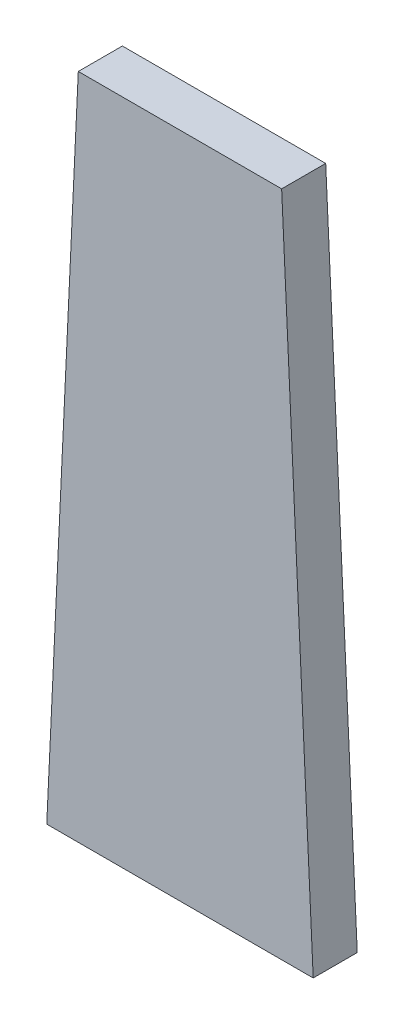
ISO-10303-21;
HEADER;
FILE_DESCRIPTION(('STEP AP214'),'2;1');
FILE_NAME('part.step','',(''),(''),'','','');
FILE_SCHEMA(('AUTOMOTIVE_DESIGN { 1 0 10303 214 1 1 1 1 }'));
ENDSEC;
DATA;
#1=APPLICATION_CONTEXT('core data for automotive mechanical design processes');
#2=APPLICATION_PROTOCOL_DEFINITION('international standard','automotive_design',2000,#1);
#3=PRODUCT_CONTEXT('',#1,'mechanical');
#4=PRODUCT('Part','Part','',(#3));
#5=PRODUCT_RELATED_PRODUCT_CATEGORY('part','',(#4));
#6=PRODUCT_DEFINITION_FORMATION('','',#4);
#7=PRODUCT_DEFINITION_CONTEXT('part definition',#1,'design');
#8=PRODUCT_DEFINITION('design','',#6,#7);
#9=PRODUCT_DEFINITION_SHAPE('','',#8);
#10=(LENGTH_UNIT() NAMED_UNIT(*) SI_UNIT(.MILLI.,.METRE.));
#11=(NAMED_UNIT(*) PLANE_ANGLE_UNIT() SI_UNIT($,.RADIAN.));
#12=(NAMED_UNIT(*) SI_UNIT($,.STERADIAN.) SOLID_ANGLE_UNIT());
#13=UNCERTAINTY_MEASURE_WITH_UNIT(LENGTH_MEASURE(1.E-05),#10,'distance_accuracy_value','');
#14=(GEOMETRIC_REPRESENTATION_CONTEXT(3) GLOBAL_UNCERTAINTY_ASSIGNED_CONTEXT((#13)) GLOBAL_UNIT_ASSIGNED_CONTEXT((#10,
#11,#12)) REPRESENTATION_CONTEXT('',''));
#15=CARTESIAN_POINT('',(0.,0.,0.));
#16=DIRECTION('',(0.,0.,1.));
#17=DIRECTION('',(1.,0.,0.));
#18=AXIS2_PLACEMENT_3D('',#15,#16,#17);
#19=CARTESIAN_POINT('',(1.15384615384615,8.07692307692307,0.5));
#20=DIRECTION('',(-0.998884766924445,-0.0472146418634893,0.));
#21=DIRECTION('',(0.0472146418634893,-0.998884766924445,0.));
#22=AXIS2_PLACEMENT_3D('',#19,#20,#21);
#23=PLANE('',#22);
#24=DIRECTION('',(0.0472146418634893,-0.998884766924445,0.));
#25=VECTOR('',#24,1.);
#26=CARTESIAN_POINT('',(1.15384615384615,8.07692307692307,1.));
#27=LINE('',#26,#25);
#28=CARTESIAN_POINT('',(1.15384615384615,8.07692307692307,1.));
#29=VERTEX_POINT('',#28);
#30=CARTESIAN_POINT('',(1.51198727417338,0.5,1.));
#31=VERTEX_POINT('',#30);
#32=EDGE_CURVE('E43',#29,#31,#27,.T.);
#33=ORIENTED_EDGE('',*,*,#32,.T.);
#34=DIRECTION('',(0.,0.,-1.));
#35=VECTOR('',#34,1.);
#36=CARTESIAN_POINT('',(1.51198727417339,0.5,0.5));
#37=LINE('',#36,#35);
#38=CARTESIAN_POINT('',(1.51198727417339,0.5,0.5));
#39=VERTEX_POINT('',#38);
#40=EDGE_CURVE('E57',#31,#39,#37,.T.);
#41=ORIENTED_EDGE('',*,*,#40,.T.);
#42=DIRECTION('',(0.0472146418634893,-0.998884766924445,0.));
#43=VECTOR('',#42,1.);
#44=CARTESIAN_POINT('',(1.15384615384615,8.07692307692307,0.5));
#45=LINE('',#44,#43);
#46=CARTESIAN_POINT('',(1.15384615384615,8.07692307692307,0.5));
#47=VERTEX_POINT('',#46);
#48=EDGE_CURVE('E81',#47,#39,#45,.T.);
#49=ORIENTED_EDGE('',*,*,#48,.F.);
#50=DIRECTION('',(0.,0.,1.));
#51=VECTOR('',#50,1.);
#52=CARTESIAN_POINT('',(1.15384615384615,8.07692307692307,0.5));
#53=LINE('',#52,#51);
#54=EDGE_CURVE('E95',#47,#29,#53,.T.);
#55=ORIENTED_EDGE('',*,*,#54,.T.);
#56=EDGE_LOOP('',(#33,#41,#49,#55));
#57=FACE_BOUND('',#56,.T.);
#58=ADVANCED_FACE('F39',(#57),#23,.F.);
#59=CARTESIAN_POINT('',(-1.92307692307693,-8.19711538461539,0.5));
#60=DIRECTION('',(0.998884766924445,-0.0472146418634893,0.));
#61=DIRECTION('',(0.0472146418634893,0.998884766924445,0.));
#62=AXIS2_PLACEMENT_3D('',#59,#60,#61);
#63=PLANE('',#62);
#64=DIRECTION('',(0.0472146418634893,0.998884766924445,0.));
#65=VECTOR('',#64,1.);
#66=CARTESIAN_POINT('',(-1.92307692307693,-8.19711538461539,0.5));
#67=LINE('',#66,#65);
#68=CARTESIAN_POINT('',(-1.51198727417339,0.5,0.5));
#69=VERTEX_POINT('',#68);
#70=CARTESIAN_POINT('',(-1.15384615384616,8.07692307692307,0.5));
#71=VERTEX_POINT('',#70);
#72=EDGE_CURVE('E91',#69,#71,#67,.T.);
#73=ORIENTED_EDGE('',*,*,#72,.F.);
#74=DIRECTION('',(0.,0.,1.));
#75=VECTOR('',#74,1.);
#76=CARTESIAN_POINT('',(-1.51198727417339,0.5,0.5));
#77=LINE('',#76,#75);
#78=CARTESIAN_POINT('',(-1.51198727417339,0.5,1.));
#79=VERTEX_POINT('',#78);
#80=EDGE_CURVE('E73',#69,#79,#77,.T.);
#81=ORIENTED_EDGE('',*,*,#80,.T.);
#82=DIRECTION('',(0.0472146418634893,0.998884766924445,0.));
#83=VECTOR('',#82,1.);
#84=CARTESIAN_POINT('',(-1.92307692307693,-8.19711538461539,1.));
#85=LINE('',#84,#83);
#86=CARTESIAN_POINT('',(-1.15384615384616,8.07692307692307,1.));
#87=VERTEX_POINT('',#86);
#88=EDGE_CURVE('E87',#79,#87,#85,.T.);
#89=ORIENTED_EDGE('',*,*,#88,.T.);
#90=DIRECTION('',(0.,0.,1.));
#91=VECTOR('',#90,1.);
#92=CARTESIAN_POINT('',(-1.15384615384616,8.07692307692307,0.5));
#93=LINE('',#92,#91);
#94=EDGE_CURVE('E47',#71,#87,#93,.T.);
#95=ORIENTED_EDGE('',*,*,#94,.F.);
#96=EDGE_LOOP('',(#73,#81,#89,#95));
#97=FACE_BOUND('',#96,.T.);
#98=ADVANCED_FACE('F90',(#97),#63,.F.);
#99=CARTESIAN_POINT('',(0.,0.,0.5));
#100=DIRECTION('',(0.,0.,-1.));
#101=DIRECTION('',(-1.,0.,0.));
#102=AXIS2_PLACEMENT_3D('',#99,#100,#101);
#103=PLANE('',#102);
#104=DIRECTION('',(1.,0.,0.));
#105=VECTOR('',#104,1.);
#106=CARTESIAN_POINT('',(0.,0.5,0.5));
#107=LINE('',#106,#105);
#108=EDGE_CURVE('E11',#69,#39,#107,.T.);
#109=ORIENTED_EDGE('',*,*,#108,.F.);
#110=ORIENTED_EDGE('',*,*,#72,.T.);
#111=DIRECTION('',(1.,0.,0.));
#112=VECTOR('',#111,1.);
#113=CARTESIAN_POINT('',(-1.15384615384616,8.07692307692307,0.5));
#114=LINE('',#113,#112);
#115=EDGE_CURVE('E96',#71,#47,#114,.T.);
#116=ORIENTED_EDGE('',*,*,#115,.T.);
#117=ORIENTED_EDGE('',*,*,#48,.T.);
#118=EDGE_LOOP('',(#109,#110,#116,#117));
#119=FACE_BOUND('',#118,.T.);
#120=ADVANCED_FACE('F111',(#119),#103,.T.);
#121=CARTESIAN_POINT('',(0.,0.,1.));
#122=DIRECTION('',(0.,0.,-1.));
#123=DIRECTION('',(-1.,0.,0.));
#124=AXIS2_PLACEMENT_3D('',#121,#122,#123);
#125=PLANE('',#124);
#126=ORIENTED_EDGE('',*,*,#88,.F.);
#127=DIRECTION('',(1.,0.,0.));
#128=VECTOR('',#127,1.);
#129=CARTESIAN_POINT('',(-17.,0.5,1.));
#130=LINE('',#129,#128);
#131=EDGE_CURVE('E77',#79,#31,#130,.T.);
#132=ORIENTED_EDGE('',*,*,#131,.T.);
#133=ORIENTED_EDGE('',*,*,#32,.F.);
#134=DIRECTION('',(1.,0.,0.));
#135=VECTOR('',#134,1.);
#136=CARTESIAN_POINT('',(-1.15384615384616,8.07692307692307,1.));
#137=LINE('',#136,#135);
#138=EDGE_CURVE('E85',#87,#29,#137,.T.);
#139=ORIENTED_EDGE('',*,*,#138,.F.);
#140=EDGE_LOOP('',(#126,#132,#133,#139));
#141=FACE_BOUND('',#140,.T.);
#142=ADVANCED_FACE('F41',(#141),#125,.F.);
#143=CARTESIAN_POINT('',(-1.15384615384616,8.07692307692307,0.5));
#144=DIRECTION('',(0.,-1.,0.));
#145=DIRECTION('',(0.,0.,-1.));
#146=AXIS2_PLACEMENT_3D('',#143,#144,#145);
#147=PLANE('',#146);
#148=ORIENTED_EDGE('',*,*,#138,.T.);
#149=ORIENTED_EDGE('',*,*,#54,.F.);
#150=ORIENTED_EDGE('',*,*,#115,.F.);
#151=ORIENTED_EDGE('',*,*,#94,.T.);
#152=EDGE_LOOP('',(#148,#149,#150,#151));
#153=FACE_BOUND('',#152,.T.);
#154=ADVANCED_FACE('F112',(#153),#147,.F.);
#155=CARTESIAN_POINT('',(-17.,0.5,1.));
#156=DIRECTION('',(0.,1.,0.));
#157=DIRECTION('',(0.,0.,1.));
#158=AXIS2_PLACEMENT_3D('',#155,#156,#157);
#159=PLANE('',#158);
#160=ORIENTED_EDGE('',*,*,#131,.F.);
#161=ORIENTED_EDGE('',*,*,#80,.F.);
#162=ORIENTED_EDGE('',*,*,#108,.T.);
#163=ORIENTED_EDGE('',*,*,#40,.F.);
#164=EDGE_LOOP('',(#160,#161,#162,#163));
#165=FACE_BOUND('',#164,.T.);
#166=ADVANCED_FACE('F76',(#165),#159,.F.);
#167=CLOSED_SHELL('',(#58,#98,#120,#142,#154,#166));
#168=MANIFOLD_SOLID_BREP('B2',#167);
#169=ADVANCED_BREP_SHAPE_REPRESENTATION('',(#18,#168),#14);
#170=SHAPE_DEFINITION_REPRESENTATION(#9,#169);
ENDSEC;
END-ISO-10303-21;
